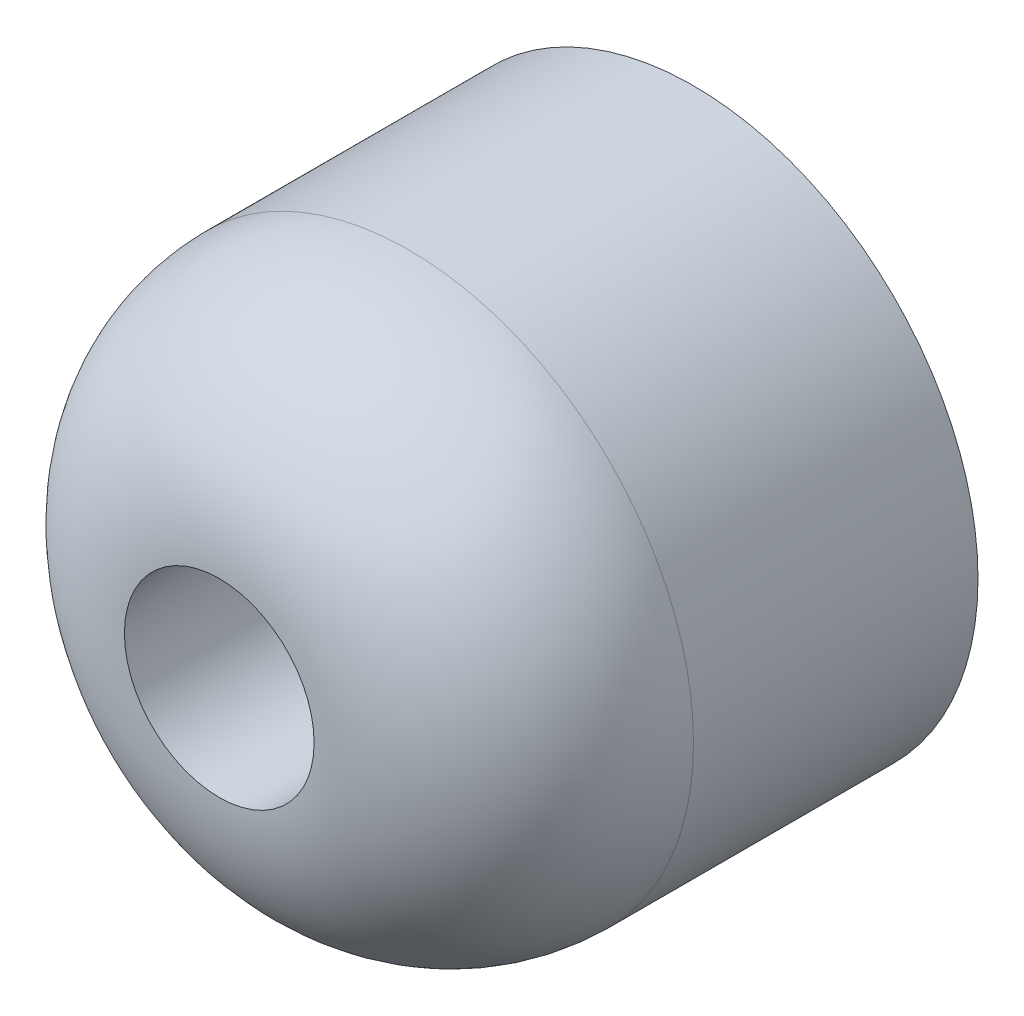
ISO-10303-21;
HEADER;
FILE_DESCRIPTION(('STEP AP214'),'2;1');
FILE_NAME('part.step','',(''),(''),'','','');
FILE_SCHEMA(('AUTOMOTIVE_DESIGN { 1 0 10303 214 1 1 1 1 }'));
ENDSEC;
DATA;
#1=APPLICATION_CONTEXT('core data for automotive mechanical design processes');
#2=APPLICATION_PROTOCOL_DEFINITION('international standard','automotive_design',2000,#1);
#3=PRODUCT_CONTEXT('',#1,'mechanical');
#4=PRODUCT('Part','Part','',(#3));
#5=PRODUCT_RELATED_PRODUCT_CATEGORY('part','',(#4));
#6=PRODUCT_DEFINITION_FORMATION('','',#4);
#7=PRODUCT_DEFINITION_CONTEXT('part definition',#1,'design');
#8=PRODUCT_DEFINITION('design','',#6,#7);
#9=PRODUCT_DEFINITION_SHAPE('','',#8);
#10=(LENGTH_UNIT() NAMED_UNIT(*) SI_UNIT(.MILLI.,.METRE.));
#11=(NAMED_UNIT(*) PLANE_ANGLE_UNIT() SI_UNIT($,.RADIAN.));
#12=(NAMED_UNIT(*) SI_UNIT($,.STERADIAN.) SOLID_ANGLE_UNIT());
#13=UNCERTAINTY_MEASURE_WITH_UNIT(LENGTH_MEASURE(1.E-05),#10,'distance_accuracy_value','');
#14=(GEOMETRIC_REPRESENTATION_CONTEXT(3) GLOBAL_UNCERTAINTY_ASSIGNED_CONTEXT((#13)) GLOBAL_UNIT_ASSIGNED_CONTEXT((#10,
#11,#12)) REPRESENTATION_CONTEXT('',''));
#15=CARTESIAN_POINT('',(0.,0.,0.));
#16=DIRECTION('',(0.,0.,1.));
#17=DIRECTION('',(1.,0.,0.));
#18=AXIS2_PLACEMENT_3D('',#15,#16,#17);
#19=CARTESIAN_POINT('',(0.,0.,5.));
#20=DIRECTION('',(0.,0.,-1.));
#21=DIRECTION('',(-1.,0.,0.));
#22=AXIS2_PLACEMENT_3D('',#19,#20,#21);
#23=CYLINDRICAL_SURFACE('',#22,3.);
#24=CARTESIAN_POINT('',(0.,0.,3.));
#25=DIRECTION('',(0.,0.,1.));
#26=DIRECTION('',(1.,0.,0.));
#27=AXIS2_PLACEMENT_3D('',#24,#25,#26);
#28=CIRCLE('',#27,3.);
#29=CARTESIAN_POINT('',(3.,0.,3.));
#30=VERTEX_POINT('',#29);
#31=EDGE_CURVE('E10',#30,#30,#28,.F.);
#32=ORIENTED_EDGE('',*,*,#31,.T.);
#33=EDGE_LOOP('',(#32));
#34=FACE_BOUND('',#33,.T.);
#35=CARTESIAN_POINT('',(0.,0.,0.));
#36=DIRECTION('',(0.,0.,1.));
#37=DIRECTION('',(1.,0.,0.));
#38=AXIS2_PLACEMENT_3D('',#35,#36,#37);
#39=CIRCLE('',#38,3.);
#40=CARTESIAN_POINT('',(3.,0.,0.));
#41=VERTEX_POINT('',#40);
#42=EDGE_CURVE('E39',#41,#41,#39,.T.);
#43=ORIENTED_EDGE('',*,*,#42,.T.);
#44=EDGE_LOOP('',(#43));
#45=FACE_BOUND('',#44,.T.);
#46=ADVANCED_FACE('F32',(#34,#45),#23,.T.);
#47=CARTESIAN_POINT('',(0.,0.,0.));
#48=DIRECTION('',(0.,0.,1.));
#49=DIRECTION('',(1.,0.,0.));
#50=AXIS2_PLACEMENT_3D('',#47,#48,#49);
#51=PLANE('',#50);
#52=CARTESIAN_POINT('',(0.,0.,0.));
#53=DIRECTION('',(0.,0.,-1.));
#54=DIRECTION('',(-1.,0.,0.));
#55=AXIS2_PLACEMENT_3D('',#52,#53,#54);
#56=CIRCLE('',#55,1.);
#57=CARTESIAN_POINT('',(-1.,0.,0.));
#58=VERTEX_POINT('',#57);
#59=EDGE_CURVE('E47',#58,#58,#56,.T.);
#60=ORIENTED_EDGE('',*,*,#59,.F.);
#61=EDGE_LOOP('',(#60));
#62=FACE_BOUND('',#61,.T.);
#63=ORIENTED_EDGE('',*,*,#42,.F.);
#64=EDGE_LOOP('',(#63));
#65=FACE_BOUND('',#64,.T.);
#66=ADVANCED_FACE('F55',(#62,#65),#51,.F.);
#67=CARTESIAN_POINT('',(0.,0.,3.));
#68=DIRECTION('',(0.,0.,1.));
#69=DIRECTION('',(1.,0.,0.));
#70=AXIS2_PLACEMENT_3D('',#67,#68,#69);
#71=DEGENERATE_TOROIDAL_SURFACE('',#70,1.,2.,.T.);
#72=ORIENTED_EDGE('',*,*,#31,.F.);
#73=EDGE_LOOP('',(#72));
#74=FACE_BOUND('',#73,.T.);
#75=CARTESIAN_POINT('',(0.,0.,5.));
#76=DIRECTION('',(0.,0.,-1.));
#77=DIRECTION('',(-1.,0.,0.));
#78=AXIS2_PLACEMENT_3D('',#75,#76,#77);
#79=CIRCLE('',#78,1.);
#80=CARTESIAN_POINT('',(-1.,0.,5.));
#81=VERTEX_POINT('',#80);
#82=EDGE_CURVE('E43',#81,#81,#79,.F.);
#83=ORIENTED_EDGE('',*,*,#82,.F.);
#84=EDGE_LOOP('',(#83));
#85=FACE_BOUND('',#84,.T.);
#86=ADVANCED_FACE('F34',(#74,#85),#71,.T.);
#87=CARTESIAN_POINT('',(0.,0.,10.));
#88=DIRECTION('',(0.,0.,-1.));
#89=DIRECTION('',(-1.,0.,0.));
#90=AXIS2_PLACEMENT_3D('',#87,#88,#89);
#91=CYLINDRICAL_SURFACE('',#90,1.);
#92=ORIENTED_EDGE('',*,*,#82,.T.);
#93=EDGE_LOOP('',(#92));
#94=FACE_BOUND('',#93,.T.);
#95=ORIENTED_EDGE('',*,*,#59,.T.);
#96=EDGE_LOOP('',(#95));
#97=FACE_BOUND('',#96,.T.);
#98=ADVANCED_FACE('F53',(#94,#97),#91,.F.);
#99=CLOSED_SHELL('',(#46,#66,#86,#98));
#100=MANIFOLD_SOLID_BREP('B2',#99);
#101=ADVANCED_BREP_SHAPE_REPRESENTATION('',(#18,#100),#14);
#102=SHAPE_DEFINITION_REPRESENTATION(#9,#101);
ENDSEC;
END-ISO-10303-21;
